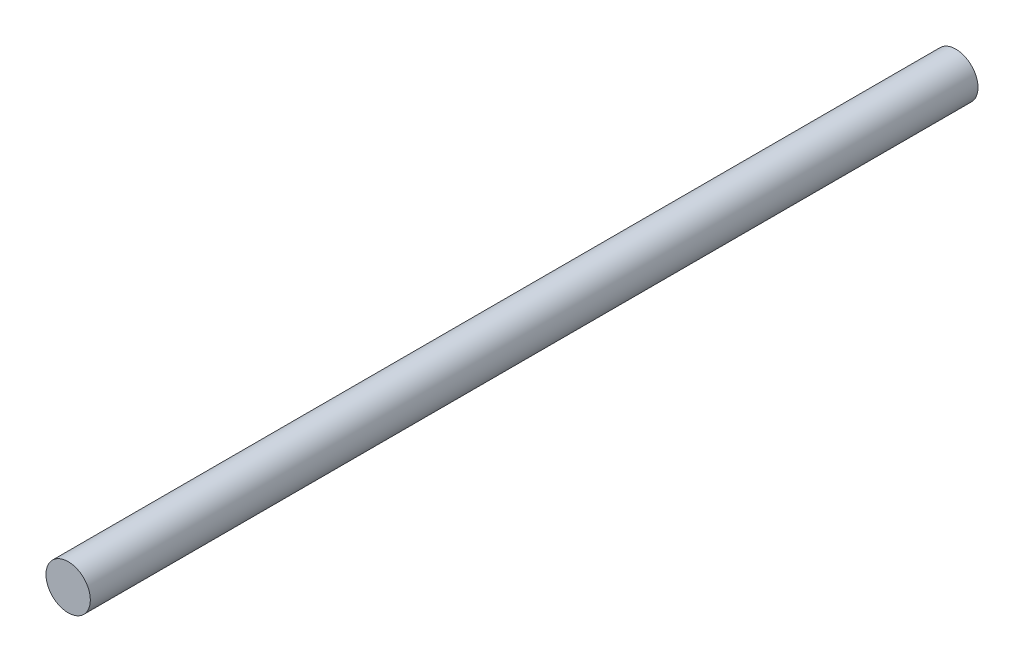
ISO-10303-21;
HEADER;
FILE_DESCRIPTION(('STEP AP214'),'2;1');
FILE_NAME('part.step','',(''),(''),'','','');
FILE_SCHEMA(('AUTOMOTIVE_DESIGN { 1 0 10303 214 1 1 1 1 }'));
ENDSEC;
DATA;
#1=APPLICATION_CONTEXT('core data for automotive mechanical design processes');
#2=APPLICATION_PROTOCOL_DEFINITION('international standard','automotive_design',2000,#1);
#3=PRODUCT_CONTEXT('',#1,'mechanical');
#4=PRODUCT('Part','Part','',(#3));
#5=PRODUCT_RELATED_PRODUCT_CATEGORY('part','',(#4));
#6=PRODUCT_DEFINITION_FORMATION('','',#4);
#7=PRODUCT_DEFINITION_CONTEXT('part definition',#1,'design');
#8=PRODUCT_DEFINITION('design','',#6,#7);
#9=PRODUCT_DEFINITION_SHAPE('','',#8);
#10=(LENGTH_UNIT() NAMED_UNIT(*) SI_UNIT(.MILLI.,.METRE.));
#11=(NAMED_UNIT(*) PLANE_ANGLE_UNIT() SI_UNIT($,.RADIAN.));
#12=(NAMED_UNIT(*) SI_UNIT($,.STERADIAN.) SOLID_ANGLE_UNIT());
#13=UNCERTAINTY_MEASURE_WITH_UNIT(LENGTH_MEASURE(1.E-05),#10,'distance_accuracy_value','');
#14=(GEOMETRIC_REPRESENTATION_CONTEXT(3) GLOBAL_UNCERTAINTY_ASSIGNED_CONTEXT((#13)) GLOBAL_UNIT_ASSIGNED_CONTEXT((#10,
#11,#12)) REPRESENTATION_CONTEXT('',''));
#15=CARTESIAN_POINT('',(0.,0.,0.));
#16=DIRECTION('',(0.,0.,1.));
#17=DIRECTION('',(1.,0.,0.));
#18=AXIS2_PLACEMENT_3D('',#15,#16,#17);
#19=CARTESIAN_POINT('',(0.,0.,80.));
#20=DIRECTION('',(0.,0.,-1.));
#21=DIRECTION('',(-1.,0.,0.));
#22=AXIS2_PLACEMENT_3D('',#19,#20,#21);
#23=CYLINDRICAL_SURFACE('',#22,4.);
#24=CARTESIAN_POINT('',(0.,0.,80.));
#25=DIRECTION('',(0.,0.,1.));
#26=DIRECTION('',(1.,0.,0.));
#27=AXIS2_PLACEMENT_3D('',#24,#25,#26);
#28=CIRCLE('',#27,4.);
#29=CARTESIAN_POINT('',(4.,0.,80.));
#30=VERTEX_POINT('',#29);
#31=EDGE_CURVE('E10',#30,#30,#28,.T.);
#32=ORIENTED_EDGE('',*,*,#31,.F.);
#33=EDGE_LOOP('',(#32));
#34=FACE_BOUND('',#33,.T.);
#35=CARTESIAN_POINT('',(0.,0.,-80.));
#36=DIRECTION('',(0.,0.,1.));
#37=DIRECTION('',(1.,0.,0.));
#38=AXIS2_PLACEMENT_3D('',#35,#36,#37);
#39=CIRCLE('',#38,4.);
#40=CARTESIAN_POINT('',(4.,0.,-80.));
#41=VERTEX_POINT('',#40);
#42=EDGE_CURVE('E36',#41,#41,#39,.T.);
#43=ORIENTED_EDGE('',*,*,#42,.T.);
#44=EDGE_LOOP('',(#43));
#45=FACE_BOUND('',#44,.T.);
#46=ADVANCED_FACE('F33',(#34,#45),#23,.T.);
#47=CARTESIAN_POINT('',(0.,0.,80.));
#48=DIRECTION('',(0.,0.,1.));
#49=DIRECTION('',(1.,0.,0.));
#50=AXIS2_PLACEMENT_3D('',#47,#48,#49);
#51=PLANE('',#50);
#52=ORIENTED_EDGE('',*,*,#31,.T.);
#53=EDGE_LOOP('',(#52));
#54=FACE_BOUND('',#53,.T.);
#55=ADVANCED_FACE('F48',(#54),#51,.T.);
#56=CARTESIAN_POINT('',(0.,0.,-80.));
#57=DIRECTION('',(0.,0.,1.));
#58=DIRECTION('',(1.,0.,0.));
#59=AXIS2_PLACEMENT_3D('',#56,#57,#58);
#60=PLANE('',#59);
#61=ORIENTED_EDGE('',*,*,#42,.F.);
#62=EDGE_LOOP('',(#61));
#63=FACE_BOUND('',#62,.T.);
#64=ADVANCED_FACE('F46',(#63),#60,.F.);
#65=CLOSED_SHELL('',(#46,#55,#64));
#66=MANIFOLD_SOLID_BREP('B2',#65);
#67=ADVANCED_BREP_SHAPE_REPRESENTATION('',(#18,#66),#14);
#68=SHAPE_DEFINITION_REPRESENTATION(#9,#67);
ENDSEC;
END-ISO-10303-21;
